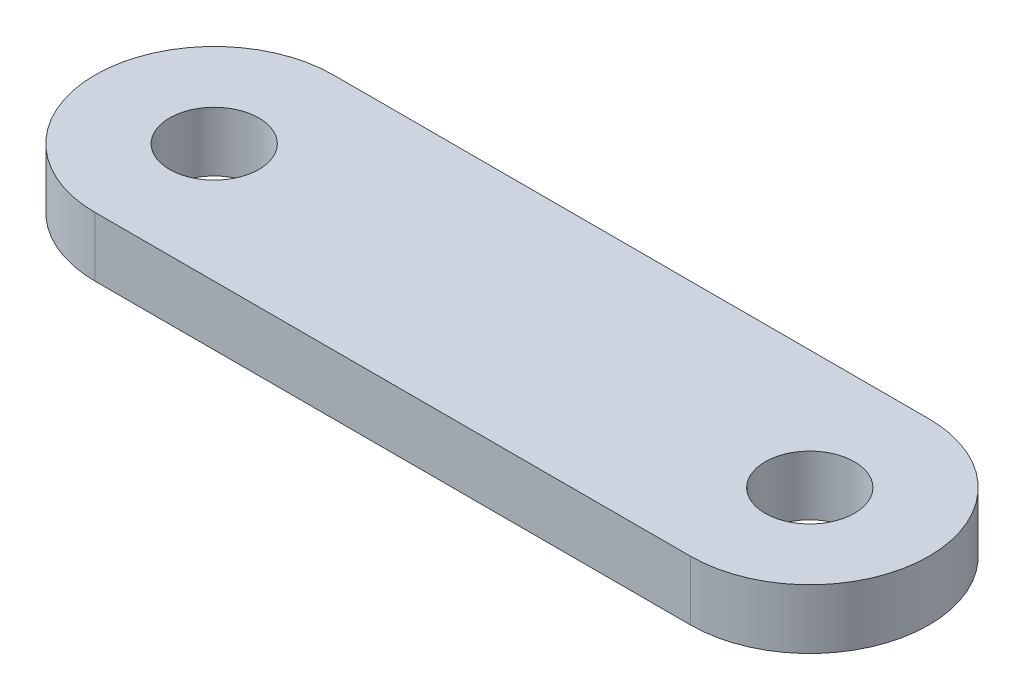
ISO-10303-21;
HEADER;
FILE_DESCRIPTION(('STEP AP214'),'2;1');
FILE_NAME('part.step','',(''),(''),'','','');
FILE_SCHEMA(('AUTOMOTIVE_DESIGN { 1 0 10303 214 1 1 1 1 }'));
ENDSEC;
DATA;
#1=APPLICATION_CONTEXT('core data for automotive mechanical design processes');
#2=APPLICATION_PROTOCOL_DEFINITION('international standard','automotive_design',2000,#1);
#3=PRODUCT_CONTEXT('',#1,'mechanical');
#4=PRODUCT('Part','Part','',(#3));
#5=PRODUCT_RELATED_PRODUCT_CATEGORY('part','',(#4));
#6=PRODUCT_DEFINITION_FORMATION('','',#4);
#7=PRODUCT_DEFINITION_CONTEXT('part definition',#1,'design');
#8=PRODUCT_DEFINITION('design','',#6,#7);
#9=PRODUCT_DEFINITION_SHAPE('','',#8);
#10=(LENGTH_UNIT() NAMED_UNIT(*) SI_UNIT(.MILLI.,.METRE.));
#11=(NAMED_UNIT(*) PLANE_ANGLE_UNIT() SI_UNIT($,.RADIAN.));
#12=(NAMED_UNIT(*) SI_UNIT($,.STERADIAN.) SOLID_ANGLE_UNIT());
#13=UNCERTAINTY_MEASURE_WITH_UNIT(LENGTH_MEASURE(1.E-05),#10,'distance_accuracy_value','');
#14=(GEOMETRIC_REPRESENTATION_CONTEXT(3) GLOBAL_UNCERTAINTY_ASSIGNED_CONTEXT((#13)) GLOBAL_UNIT_ASSIGNED_CONTEXT((#10,
#11,#12)) REPRESENTATION_CONTEXT('',''));
#15=CARTESIAN_POINT('',(0.,0.,0.));
#16=DIRECTION('',(0.,0.,1.));
#17=DIRECTION('',(1.,0.,0.));
#18=AXIS2_PLACEMENT_3D('',#15,#16,#17);
#19=CARTESIAN_POINT('',(-12.7,2.54,0.));
#20=DIRECTION('',(0.,1.,0.));
#21=DIRECTION('',(0.,0.,1.));
#22=AXIS2_PLACEMENT_3D('',#19,#20,#21);
#23=PLANE('',#22);
#24=CARTESIAN_POINT('',(-12.7,2.54,0.));
#25=DIRECTION('',(0.,1.,0.));
#26=DIRECTION('',(0.,0.,1.));
#27=AXIS2_PLACEMENT_3D('',#24,#25,#26);
#28=CIRCLE('',#27,1.905);
#29=CARTESIAN_POINT('',(-12.7,2.54,1.905));
#30=VERTEX_POINT('',#29);
#31=EDGE_CURVE('E102',#30,#30,#28,.T.);
#32=ORIENTED_EDGE('',*,*,#31,.F.);
#33=EDGE_LOOP('',(#32));
#34=FACE_BOUND('',#33,.T.);
#35=CARTESIAN_POINT('',(-12.7,2.54,0.));
#36=DIRECTION('',(0.,1.,0.));
#37=DIRECTION('',(0.,0.,1.));
#38=AXIS2_PLACEMENT_3D('',#35,#36,#37);
#39=CIRCLE('',#38,5.08);
#40=CARTESIAN_POINT('',(-12.7,2.54,-5.08));
#41=VERTEX_POINT('',#40);
#42=CARTESIAN_POINT('',(-12.7,2.54,5.08));
#43=VERTEX_POINT('',#42);
#44=EDGE_CURVE('E87',#41,#43,#39,.T.);
#45=ORIENTED_EDGE('',*,*,#44,.T.);
#46=DIRECTION('',(1.,0.,0.));
#47=VECTOR('',#46,1.);
#48=CARTESIAN_POINT('',(-12.7,2.54,5.08));
#49=LINE('',#48,#47);
#50=CARTESIAN_POINT('',(12.7,2.54,5.08));
#51=VERTEX_POINT('',#50);
#52=EDGE_CURVE('E82',#43,#51,#49,.T.);
#53=ORIENTED_EDGE('',*,*,#52,.T.);
#54=CARTESIAN_POINT('',(12.7,2.54,0.));
#55=DIRECTION('',(0.,1.,0.));
#56=DIRECTION('',(0.,0.,1.));
#57=AXIS2_PLACEMENT_3D('',#54,#55,#56);
#58=CIRCLE('',#57,5.08);
#59=CARTESIAN_POINT('',(12.7,2.54,-5.08000000000001));
#60=VERTEX_POINT('',#59);
#61=EDGE_CURVE('E85',#51,#60,#58,.T.);
#62=ORIENTED_EDGE('',*,*,#61,.T.);
#63=DIRECTION('',(-1.,0.,0.));
#64=VECTOR('',#63,1.);
#65=CARTESIAN_POINT('',(-12.7,2.54,-5.08));
#66=LINE('',#65,#64);
#67=EDGE_CURVE('E52',#60,#41,#66,.T.);
#68=ORIENTED_EDGE('',*,*,#67,.T.);
#69=EDGE_LOOP('',(#45,#53,#62,#68));
#70=FACE_BOUND('',#69,.T.);
#71=CARTESIAN_POINT('',(12.7,2.54,0.));
#72=DIRECTION('',(0.,1.,0.));
#73=DIRECTION('',(0.,0.,1.));
#74=AXIS2_PLACEMENT_3D('',#71,#72,#73);
#75=CIRCLE('',#74,1.905);
#76=CARTESIAN_POINT('',(12.7,2.54,1.90499999999999));
#77=VERTEX_POINT('',#76);
#78=EDGE_CURVE('E117',#77,#77,#75,.T.);
#79=ORIENTED_EDGE('',*,*,#78,.F.);
#80=EDGE_LOOP('',(#79));
#81=FACE_BOUND('',#80,.T.);
#82=ADVANCED_FACE('F35',(#34,#70,#81),#23,.T.);
#83=CARTESIAN_POINT('',(-12.7,0.,0.));
#84=DIRECTION('',(0.,1.,0.));
#85=DIRECTION('',(0.,0.,1.));
#86=AXIS2_PLACEMENT_3D('',#83,#84,#85);
#87=PLANE('',#86);
#88=CARTESIAN_POINT('',(-12.7,0.,0.));
#89=DIRECTION('',(0.,1.,0.));
#90=DIRECTION('',(0.,0.,1.));
#91=AXIS2_PLACEMENT_3D('',#88,#89,#90);
#92=CIRCLE('',#91,5.08);
#93=CARTESIAN_POINT('',(-12.7,0.,-5.08));
#94=VERTEX_POINT('',#93);
#95=CARTESIAN_POINT('',(-12.7,0.,5.08));
#96=VERTEX_POINT('',#95);
#97=EDGE_CURVE('E99',#94,#96,#92,.T.);
#98=ORIENTED_EDGE('',*,*,#97,.F.);
#99=DIRECTION('',(-1.,0.,0.));
#100=VECTOR('',#99,1.);
#101=CARTESIAN_POINT('',(-12.7,0.,-5.08));
#102=LINE('',#101,#100);
#103=CARTESIAN_POINT('',(12.7,0.,-5.08000000000001));
#104=VERTEX_POINT('',#103);
#105=EDGE_CURVE('E75',#104,#94,#102,.T.);
#106=ORIENTED_EDGE('',*,*,#105,.F.);
#107=CARTESIAN_POINT('',(12.7,0.,0.));
#108=DIRECTION('',(0.,1.,0.));
#109=DIRECTION('',(0.,0.,1.));
#110=AXIS2_PLACEMENT_3D('',#107,#108,#109);
#111=CIRCLE('',#110,5.08);
#112=CARTESIAN_POINT('',(12.7,0.,5.08));
#113=VERTEX_POINT('',#112);
#114=EDGE_CURVE('E69',#113,#104,#111,.T.);
#115=ORIENTED_EDGE('',*,*,#114,.F.);
#116=DIRECTION('',(1.,0.,0.));
#117=VECTOR('',#116,1.);
#118=CARTESIAN_POINT('',(-12.7,0.,5.08));
#119=LINE('',#118,#117);
#120=EDGE_CURVE('E91',#96,#113,#119,.T.);
#121=ORIENTED_EDGE('',*,*,#120,.F.);
#122=EDGE_LOOP('',(#98,#106,#115,#121));
#123=FACE_BOUND('',#122,.T.);
#124=CARTESIAN_POINT('',(-12.7,0.,0.));
#125=DIRECTION('',(0.,1.,0.));
#126=DIRECTION('',(0.,0.,1.));
#127=AXIS2_PLACEMENT_3D('',#124,#125,#126);
#128=CIRCLE('',#127,1.905);
#129=CARTESIAN_POINT('',(-12.7,0.,1.905));
#130=VERTEX_POINT('',#129);
#131=EDGE_CURVE('E114',#130,#130,#128,.T.);
#132=ORIENTED_EDGE('',*,*,#131,.T.);
#133=EDGE_LOOP('',(#132));
#134=FACE_BOUND('',#133,.T.);
#135=CARTESIAN_POINT('',(12.7,0.,0.));
#136=DIRECTION('',(0.,1.,0.));
#137=DIRECTION('',(0.,0.,1.));
#138=AXIS2_PLACEMENT_3D('',#135,#136,#137);
#139=CIRCLE('',#138,1.905);
#140=CARTESIAN_POINT('',(12.7,0.,1.90499999999999));
#141=VERTEX_POINT('',#140);
#142=EDGE_CURVE('E120',#141,#141,#139,.T.);
#143=ORIENTED_EDGE('',*,*,#142,.T.);
#144=EDGE_LOOP('',(#143));
#145=FACE_BOUND('',#144,.T.);
#146=ADVANCED_FACE('F110',(#123,#134,#145),#87,.F.);
#147=CARTESIAN_POINT('',(-12.7,2.54,0.));
#148=DIRECTION('',(0.,-1.,0.));
#149=DIRECTION('',(0.,0.,-1.));
#150=AXIS2_PLACEMENT_3D('',#147,#148,#149);
#151=CYLINDRICAL_SURFACE('',#150,5.08);
#152=ORIENTED_EDGE('',*,*,#97,.T.);
#153=DIRECTION('',(0.,-1.,0.));
#154=VECTOR('',#153,1.);
#155=CARTESIAN_POINT('',(-12.7,2.54,5.08));
#156=LINE('',#155,#154);
#157=EDGE_CURVE('E11',#43,#96,#156,.T.);
#158=ORIENTED_EDGE('',*,*,#157,.F.);
#159=ORIENTED_EDGE('',*,*,#44,.F.);
#160=DIRECTION('',(0.,-1.,0.));
#161=VECTOR('',#160,1.);
#162=CARTESIAN_POINT('',(-12.7,2.54,-5.08));
#163=LINE('',#162,#161);
#164=EDGE_CURVE('E95',#41,#94,#163,.T.);
#165=ORIENTED_EDGE('',*,*,#164,.T.);
#166=EDGE_LOOP('',(#152,#158,#159,#165));
#167=FACE_BOUND('',#166,.T.);
#168=ADVANCED_FACE('F37',(#167),#151,.T.);
#169=CARTESIAN_POINT('',(-12.7,2.54,5.08));
#170=DIRECTION('',(0.,0.,-1.));
#171=DIRECTION('',(-1.,0.,0.));
#172=AXIS2_PLACEMENT_3D('',#169,#170,#171);
#173=PLANE('',#172);
#174=ORIENTED_EDGE('',*,*,#120,.T.);
#175=DIRECTION('',(0.,-1.,0.));
#176=VECTOR('',#175,1.);
#177=CARTESIAN_POINT('',(12.7,2.54,5.08));
#178=LINE('',#177,#176);
#179=EDGE_CURVE('E44',#51,#113,#178,.T.);
#180=ORIENTED_EDGE('',*,*,#179,.F.);
#181=ORIENTED_EDGE('',*,*,#52,.F.);
#182=ORIENTED_EDGE('',*,*,#157,.T.);
#183=EDGE_LOOP('',(#174,#180,#181,#182));
#184=FACE_BOUND('',#183,.T.);
#185=ADVANCED_FACE('F90',(#184),#173,.F.);
#186=CARTESIAN_POINT('',(12.7,2.54,0.));
#187=DIRECTION('',(0.,-1.,0.));
#188=DIRECTION('',(0.,0.,-1.));
#189=AXIS2_PLACEMENT_3D('',#186,#187,#188);
#190=CYLINDRICAL_SURFACE('',#189,5.08);
#191=ORIENTED_EDGE('',*,*,#114,.T.);
#192=DIRECTION('',(0.,-1.,0.));
#193=VECTOR('',#192,1.);
#194=CARTESIAN_POINT('',(12.7,2.54,-5.08000000000001));
#195=LINE('',#194,#193);
#196=EDGE_CURVE('E92',#60,#104,#195,.T.);
#197=ORIENTED_EDGE('',*,*,#196,.F.);
#198=ORIENTED_EDGE('',*,*,#61,.F.);
#199=ORIENTED_EDGE('',*,*,#179,.T.);
#200=EDGE_LOOP('',(#191,#197,#198,#199));
#201=FACE_BOUND('',#200,.T.);
#202=ADVANCED_FACE('F93',(#201),#190,.T.);
#203=CARTESIAN_POINT('',(-12.7,2.54,-5.08));
#204=DIRECTION('',(0.,0.,1.));
#205=DIRECTION('',(1.,0.,0.));
#206=AXIS2_PLACEMENT_3D('',#203,#204,#205);
#207=PLANE('',#206);
#208=ORIENTED_EDGE('',*,*,#105,.T.);
#209=ORIENTED_EDGE('',*,*,#164,.F.);
#210=ORIENTED_EDGE('',*,*,#67,.F.);
#211=ORIENTED_EDGE('',*,*,#196,.T.);
#212=EDGE_LOOP('',(#208,#209,#210,#211));
#213=FACE_BOUND('',#212,.T.);
#214=ADVANCED_FACE('F107',(#213),#207,.F.);
#215=CARTESIAN_POINT('',(-12.7,2.54,0.));
#216=DIRECTION('',(0.,-1.,0.));
#217=DIRECTION('',(0.,0.,-1.));
#218=AXIS2_PLACEMENT_3D('',#215,#216,#217);
#219=CYLINDRICAL_SURFACE('',#218,1.905);
#220=ORIENTED_EDGE('',*,*,#31,.T.);
#221=EDGE_LOOP('',(#220));
#222=FACE_BOUND('',#221,.T.);
#223=ORIENTED_EDGE('',*,*,#131,.F.);
#224=EDGE_LOOP('',(#223));
#225=FACE_BOUND('',#224,.T.);
#226=ADVANCED_FACE('F137',(#222,#225),#219,.F.);
#227=CARTESIAN_POINT('',(12.7,2.54,0.));
#228=DIRECTION('',(0.,-1.,0.));
#229=DIRECTION('',(0.,0.,-1.));
#230=AXIS2_PLACEMENT_3D('',#227,#228,#229);
#231=CYLINDRICAL_SURFACE('',#230,1.905);
#232=ORIENTED_EDGE('',*,*,#78,.T.);
#233=EDGE_LOOP('',(#232));
#234=FACE_BOUND('',#233,.T.);
#235=ORIENTED_EDGE('',*,*,#142,.F.);
#236=EDGE_LOOP('',(#235));
#237=FACE_BOUND('',#236,.T.);
#238=ADVANCED_FACE('F126',(#234,#237),#231,.F.);
#239=CLOSED_SHELL('',(#82,#146,#168,#185,#202,#214,#226,#238));
#240=MANIFOLD_SOLID_BREP('B2',#239);
#241=ADVANCED_BREP_SHAPE_REPRESENTATION('',(#18,#240),#14);
#242=SHAPE_DEFINITION_REPRESENTATION(#9,#241);
ENDSEC;
END-ISO-10303-21;
